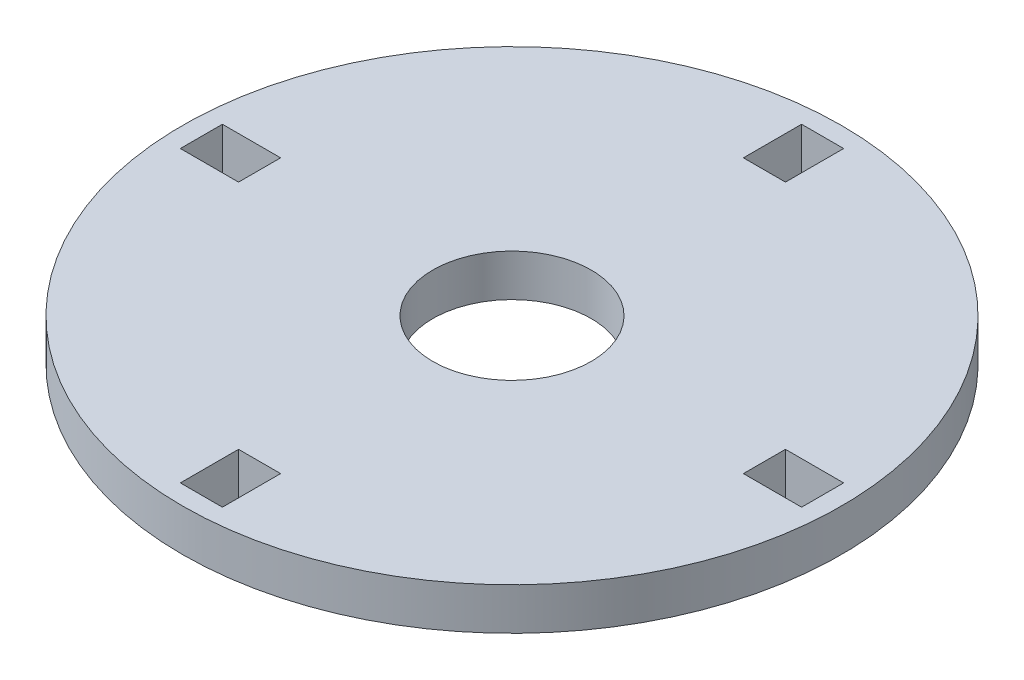
ISO-10303-21;
HEADER;
FILE_DESCRIPTION(('STEP AP214'),'2;1');
FILE_NAME('part.step','',(''),(''),'','','');
FILE_SCHEMA(('AUTOMOTIVE_DESIGN { 1 0 10303 214 1 1 1 1 }'));
ENDSEC;
DATA;
#1=APPLICATION_CONTEXT('core data for automotive mechanical design processes');
#2=APPLICATION_PROTOCOL_DEFINITION('international standard','automotive_design',2000,#1);
#3=PRODUCT_CONTEXT('',#1,'mechanical');
#4=PRODUCT('Part','Part','',(#3));
#5=PRODUCT_RELATED_PRODUCT_CATEGORY('part','',(#4));
#6=PRODUCT_DEFINITION_FORMATION('','',#4);
#7=PRODUCT_DEFINITION_CONTEXT('part definition',#1,'design');
#8=PRODUCT_DEFINITION('design','',#6,#7);
#9=PRODUCT_DEFINITION_SHAPE('','',#8);
#10=(LENGTH_UNIT() NAMED_UNIT(*) SI_UNIT(.MILLI.,.METRE.));
#11=(NAMED_UNIT(*) PLANE_ANGLE_UNIT() SI_UNIT($,.RADIAN.));
#12=(NAMED_UNIT(*) SI_UNIT($,.STERADIAN.) SOLID_ANGLE_UNIT());
#13=UNCERTAINTY_MEASURE_WITH_UNIT(LENGTH_MEASURE(1.E-05),#10,'distance_accuracy_value','');
#14=(GEOMETRIC_REPRESENTATION_CONTEXT(3) GLOBAL_UNCERTAINTY_ASSIGNED_CONTEXT((#13)) GLOBAL_UNIT_ASSIGNED_CONTEXT((#10,
#11,#12)) REPRESENTATION_CONTEXT('',''));
#15=CARTESIAN_POINT('',(0.,0.,0.));
#16=DIRECTION('',(0.,0.,1.));
#17=DIRECTION('',(1.,0.,0.));
#18=AXIS2_PLACEMENT_3D('',#15,#16,#17);
#19=CARTESIAN_POINT('',(0.,3.,0.));
#20=DIRECTION('',(0.,-1.,0.));
#21=DIRECTION('',(0.,0.,-1.));
#22=AXIS2_PLACEMENT_3D('',#19,#20,#21);
#23=CYLINDRICAL_SURFACE('',#22,23.5);
#24=CARTESIAN_POINT('',(0.,3.,0.));
#25=DIRECTION('',(0.,1.,0.));
#26=DIRECTION('',(0.,0.,1.));
#27=AXIS2_PLACEMENT_3D('',#24,#25,#26);
#28=CIRCLE('',#27,23.5);
#29=CARTESIAN_POINT('',(0.,3.,23.5));
#30=VERTEX_POINT('',#29);
#31=EDGE_CURVE('E13',#30,#30,#28,.T.);
#32=ORIENTED_EDGE('',*,*,#31,.F.);
#33=EDGE_LOOP('',(#32));
#34=FACE_BOUND('',#33,.T.);
#35=CARTESIAN_POINT('',(0.,0.,0.));
#36=DIRECTION('',(0.,1.,0.));
#37=DIRECTION('',(0.,0.,1.));
#38=AXIS2_PLACEMENT_3D('',#35,#36,#37);
#39=CIRCLE('',#38,23.5);
#40=CARTESIAN_POINT('',(0.,0.,23.5));
#41=VERTEX_POINT('',#40);
#42=EDGE_CURVE('E47',#41,#41,#39,.T.);
#43=ORIENTED_EDGE('',*,*,#42,.T.);
#44=EDGE_LOOP('',(#43));
#45=FACE_BOUND('',#44,.T.);
#46=ADVANCED_FACE('F44',(#34,#45),#23,.T.);
#47=CARTESIAN_POINT('',(0.,3.,0.));
#48=DIRECTION('',(0.,1.,0.));
#49=DIRECTION('',(0.,0.,1.));
#50=AXIS2_PLACEMENT_3D('',#47,#48,#49);
#51=PLANE('',#50);
#52=DIRECTION('',(0.,0.,1.));
#53=VECTOR('',#52,1.);
#54=CARTESIAN_POINT('',(1.5,3.,22.15));
#55=LINE('',#54,#53);
#56=CARTESIAN_POINT('',(1.5,3.,18.));
#57=VERTEX_POINT('',#56);
#58=CARTESIAN_POINT('',(1.5,3.,22.15));
#59=VERTEX_POINT('',#58);
#60=EDGE_CURVE('E160',#57,#59,#55,.T.);
#61=ORIENTED_EDGE('',*,*,#60,.T.);
#62=DIRECTION('',(-1.,0.,0.));
#63=VECTOR('',#62,1.);
#64=CARTESIAN_POINT('',(-1.5,3.,22.15));
#65=LINE('',#64,#63);
#66=CARTESIAN_POINT('',(-1.5,3.,22.15));
#67=VERTEX_POINT('',#66);
#68=EDGE_CURVE('E171',#59,#67,#65,.T.);
#69=ORIENTED_EDGE('',*,*,#68,.T.);
#70=DIRECTION('',(0.,0.,-1.));
#71=VECTOR('',#70,1.);
#72=CARTESIAN_POINT('',(-1.5,3.,22.15));
#73=LINE('',#72,#71);
#74=CARTESIAN_POINT('',(-1.5,3.,18.));
#75=VERTEX_POINT('',#74);
#76=EDGE_CURVE('E58',#67,#75,#73,.T.);
#77=ORIENTED_EDGE('',*,*,#76,.T.);
#78=DIRECTION('',(1.,0.,0.));
#79=VECTOR('',#78,1.);
#80=CARTESIAN_POINT('',(-1.5,3.,18.));
#81=LINE('',#80,#79);
#82=EDGE_CURVE('E168',#75,#57,#81,.T.);
#83=ORIENTED_EDGE('',*,*,#82,.T.);
#84=EDGE_LOOP('',(#61,#69,#77,#83));
#85=FACE_BOUND('',#84,.T.);
#86=DIRECTION('',(0.,0.,-1.));
#87=VECTOR('',#86,1.);
#88=CARTESIAN_POINT('',(18.,3.,1.49999999999994));
#89=LINE('',#88,#87);
#90=CARTESIAN_POINT('',(18.,3.,1.49999999999994));
#91=VERTEX_POINT('',#90);
#92=CARTESIAN_POINT('',(18.,3.,-1.50000000000006));
#93=VERTEX_POINT('',#92);
#94=EDGE_CURVE('E198',#91,#93,#89,.T.);
#95=ORIENTED_EDGE('',*,*,#94,.T.);
#96=DIRECTION('',(1.,0.,0.));
#97=VECTOR('',#96,1.);
#98=CARTESIAN_POINT('',(22.15,3.,-1.50000000000007));
#99=LINE('',#98,#97);
#100=CARTESIAN_POINT('',(22.15,3.,-1.50000000000007));
#101=VERTEX_POINT('',#100);
#102=EDGE_CURVE('E201',#93,#101,#99,.T.);
#103=ORIENTED_EDGE('',*,*,#102,.T.);
#104=DIRECTION('',(0.,0.,1.));
#105=VECTOR('',#104,1.);
#106=CARTESIAN_POINT('',(22.15,3.,1.49999999999993));
#107=LINE('',#106,#105);
#108=CARTESIAN_POINT('',(22.15,3.,1.49999999999993));
#109=VERTEX_POINT('',#108);
#110=EDGE_CURVE('E66',#101,#109,#107,.T.);
#111=ORIENTED_EDGE('',*,*,#110,.T.);
#112=DIRECTION('',(-1.,0.,0.));
#113=VECTOR('',#112,1.);
#114=CARTESIAN_POINT('',(22.15,3.,1.49999999999993));
#115=LINE('',#114,#113);
#116=EDGE_CURVE('E206',#109,#91,#115,.T.);
#117=ORIENTED_EDGE('',*,*,#116,.T.);
#118=EDGE_LOOP('',(#95,#103,#111,#117));
#119=FACE_BOUND('',#118,.T.);
#120=DIRECTION('',(-1.,0.,0.));
#121=VECTOR('',#120,1.);
#122=CARTESIAN_POINT('',(1.49999999999987,3.,-18.));
#123=LINE('',#122,#121);
#124=CARTESIAN_POINT('',(1.49999999999987,3.,-18.));
#125=VERTEX_POINT('',#124);
#126=CARTESIAN_POINT('',(-1.50000000000013,3.,-18.));
#127=VERTEX_POINT('',#126);
#128=EDGE_CURVE('E228',#125,#127,#123,.T.);
#129=ORIENTED_EDGE('',*,*,#128,.T.);
#130=DIRECTION('',(0.,0.,-1.));
#131=VECTOR('',#130,1.);
#132=CARTESIAN_POINT('',(-1.50000000000015,3.,-22.15));
#133=LINE('',#132,#131);
#134=CARTESIAN_POINT('',(-1.50000000000015,3.,-22.15));
#135=VERTEX_POINT('',#134);
#136=EDGE_CURVE('E231',#127,#135,#133,.T.);
#137=ORIENTED_EDGE('',*,*,#136,.T.);
#138=DIRECTION('',(1.,0.,0.));
#139=VECTOR('',#138,1.);
#140=CARTESIAN_POINT('',(1.49999999999985,3.,-22.15));
#141=LINE('',#140,#139);
#142=CARTESIAN_POINT('',(1.49999999999985,3.,-22.15));
#143=VERTEX_POINT('',#142);
#144=EDGE_CURVE('E235',#135,#143,#141,.T.);
#145=ORIENTED_EDGE('',*,*,#144,.T.);
#146=DIRECTION('',(0.,0.,1.));
#147=VECTOR('',#146,1.);
#148=CARTESIAN_POINT('',(1.49999999999985,3.,-22.15));
#149=LINE('',#148,#147);
#150=EDGE_CURVE('E238',#143,#125,#149,.T.);
#151=ORIENTED_EDGE('',*,*,#150,.T.);
#152=EDGE_LOOP('',(#129,#137,#145,#151));
#153=FACE_BOUND('',#152,.T.);
#154=DIRECTION('',(0.,0.,1.));
#155=VECTOR('',#154,1.);
#156=CARTESIAN_POINT('',(-18.,3.,-1.49999999999981));
#157=LINE('',#156,#155);
#158=CARTESIAN_POINT('',(-18.,3.,-1.49999999999981));
#159=VERTEX_POINT('',#158);
#160=CARTESIAN_POINT('',(-18.,3.,1.50000000000019));
#161=VERTEX_POINT('',#160);
#162=EDGE_CURVE('E260',#159,#161,#157,.T.);
#163=ORIENTED_EDGE('',*,*,#162,.T.);
#164=DIRECTION('',(-1.,0.,0.));
#165=VECTOR('',#164,1.);
#166=CARTESIAN_POINT('',(-22.15,3.,1.50000000000023));
#167=LINE('',#166,#165);
#168=CARTESIAN_POINT('',(-22.15,3.,1.50000000000023));
#169=VERTEX_POINT('',#168);
#170=EDGE_CURVE('E263',#161,#169,#167,.T.);
#171=ORIENTED_EDGE('',*,*,#170,.T.);
#172=DIRECTION('',(0.,0.,-1.));
#173=VECTOR('',#172,1.);
#174=CARTESIAN_POINT('',(-22.15,3.,-1.49999999999977));
#175=LINE('',#174,#173);
#176=CARTESIAN_POINT('',(-22.15,3.,-1.49999999999977));
#177=VERTEX_POINT('',#176);
#178=EDGE_CURVE('E267',#169,#177,#175,.T.);
#179=ORIENTED_EDGE('',*,*,#178,.T.);
#180=DIRECTION('',(1.,0.,0.));
#181=VECTOR('',#180,1.);
#182=CARTESIAN_POINT('',(-22.15,3.,-1.49999999999977));
#183=LINE('',#182,#181);
#184=EDGE_CURVE('E270',#177,#159,#183,.T.);
#185=ORIENTED_EDGE('',*,*,#184,.T.);
#186=EDGE_LOOP('',(#163,#171,#179,#185));
#187=FACE_BOUND('',#186,.T.);
#188=CARTESIAN_POINT('',(0.,3.,0.));
#189=DIRECTION('',(0.,1.,0.));
#190=DIRECTION('',(0.,0.,1.));
#191=AXIS2_PLACEMENT_3D('',#188,#189,#190);
#192=CIRCLE('',#191,5.65);
#193=CARTESIAN_POINT('',(0.,3.,5.65));
#194=VERTEX_POINT('',#193);
#195=EDGE_CURVE('E194',#194,#194,#192,.T.);
#196=ORIENTED_EDGE('',*,*,#195,.F.);
#197=EDGE_LOOP('',(#196));
#198=FACE_BOUND('',#197,.T.);
#199=ORIENTED_EDGE('',*,*,#31,.T.);
#200=EDGE_LOOP('',(#199));
#201=FACE_BOUND('',#200,.T.);
#202=ADVANCED_FACE('F175',(#85,#119,#153,#187,#198,#201),#51,.T.);
#203=CARTESIAN_POINT('',(0.,0.,0.));
#204=DIRECTION('',(0.,1.,0.));
#205=DIRECTION('',(0.,0.,1.));
#206=AXIS2_PLACEMENT_3D('',#203,#204,#205);
#207=PLANE('',#206);
#208=DIRECTION('',(-1.,0.,0.));
#209=VECTOR('',#208,1.);
#210=CARTESIAN_POINT('',(-1.5,0.,22.15));
#211=LINE('',#210,#209);
#212=CARTESIAN_POINT('',(1.5,0.,22.15));
#213=VERTEX_POINT('',#212);
#214=CARTESIAN_POINT('',(-1.5,0.,22.15));
#215=VERTEX_POINT('',#214);
#216=EDGE_CURVE('E187',#213,#215,#211,.T.);
#217=ORIENTED_EDGE('',*,*,#216,.F.);
#218=DIRECTION('',(0.,0.,1.));
#219=VECTOR('',#218,1.);
#220=CARTESIAN_POINT('',(1.5,0.,22.15));
#221=LINE('',#220,#219);
#222=CARTESIAN_POINT('',(1.5,0.,18.));
#223=VERTEX_POINT('',#222);
#224=EDGE_CURVE('E163',#223,#213,#221,.T.);
#225=ORIENTED_EDGE('',*,*,#224,.F.);
#226=DIRECTION('',(1.,0.,0.));
#227=VECTOR('',#226,1.);
#228=CARTESIAN_POINT('',(-1.5,0.,18.));
#229=LINE('',#228,#227);
#230=CARTESIAN_POINT('',(-1.5,0.,18.));
#231=VERTEX_POINT('',#230);
#232=EDGE_CURVE('E178',#231,#223,#229,.T.);
#233=ORIENTED_EDGE('',*,*,#232,.F.);
#234=DIRECTION('',(0.,0.,-1.));
#235=VECTOR('',#234,1.);
#236=CARTESIAN_POINT('',(-1.5,0.,22.15));
#237=LINE('',#236,#235);
#238=EDGE_CURVE('E181',#215,#231,#237,.T.);
#239=ORIENTED_EDGE('',*,*,#238,.F.);
#240=EDGE_LOOP('',(#217,#225,#233,#239));
#241=FACE_BOUND('',#240,.T.);
#242=DIRECTION('',(1.,0.,0.));
#243=VECTOR('',#242,1.);
#244=CARTESIAN_POINT('',(22.15,0.,-1.50000000000007));
#245=LINE('',#244,#243);
#246=CARTESIAN_POINT('',(18.,0.,-1.50000000000006));
#247=VERTEX_POINT('',#246);
#248=CARTESIAN_POINT('',(22.15,0.,-1.50000000000007));
#249=VERTEX_POINT('',#248);
#250=EDGE_CURVE('E212',#247,#249,#245,.T.);
#251=ORIENTED_EDGE('',*,*,#250,.F.);
#252=DIRECTION('',(0.,0.,-1.));
#253=VECTOR('',#252,1.);
#254=CARTESIAN_POINT('',(18.,0.,1.49999999999994));
#255=LINE('',#254,#253);
#256=CARTESIAN_POINT('',(18.,0.,1.49999999999994));
#257=VERTEX_POINT('',#256);
#258=EDGE_CURVE('E210',#257,#247,#255,.T.);
#259=ORIENTED_EDGE('',*,*,#258,.F.);
#260=DIRECTION('',(-1.,0.,0.));
#261=VECTOR('',#260,1.);
#262=CARTESIAN_POINT('',(22.15,0.,1.49999999999993));
#263=LINE('',#262,#261);
#264=CARTESIAN_POINT('',(22.15,0.,1.49999999999993));
#265=VERTEX_POINT('',#264);
#266=EDGE_CURVE('E202',#265,#257,#263,.T.);
#267=ORIENTED_EDGE('',*,*,#266,.F.);
#268=DIRECTION('',(0.,0.,1.));
#269=VECTOR('',#268,1.);
#270=CARTESIAN_POINT('',(22.15,0.,1.49999999999993));
#271=LINE('',#270,#269);
#272=EDGE_CURVE('E216',#249,#265,#271,.T.);
#273=ORIENTED_EDGE('',*,*,#272,.F.);
#274=EDGE_LOOP('',(#251,#259,#267,#273));
#275=FACE_BOUND('',#274,.T.);
#276=DIRECTION('',(0.,0.,-1.));
#277=VECTOR('',#276,1.);
#278=CARTESIAN_POINT('',(-1.50000000000015,0.,-22.15));
#279=LINE('',#278,#277);
#280=CARTESIAN_POINT('',(-1.50000000000013,0.,-18.));
#281=VERTEX_POINT('',#280);
#282=CARTESIAN_POINT('',(-1.50000000000015,0.,-22.15));
#283=VERTEX_POINT('',#282);
#284=EDGE_CURVE('E244',#281,#283,#279,.T.);
#285=ORIENTED_EDGE('',*,*,#284,.F.);
#286=DIRECTION('',(-1.,0.,0.));
#287=VECTOR('',#286,1.);
#288=CARTESIAN_POINT('',(1.49999999999987,0.,-18.));
#289=LINE('',#288,#287);
#290=CARTESIAN_POINT('',(1.49999999999987,0.,-18.));
#291=VERTEX_POINT('',#290);
#292=EDGE_CURVE('E242',#291,#281,#289,.T.);
#293=ORIENTED_EDGE('',*,*,#292,.F.);
#294=DIRECTION('',(0.,0.,1.));
#295=VECTOR('',#294,1.);
#296=CARTESIAN_POINT('',(1.49999999999985,0.,-22.15));
#297=LINE('',#296,#295);
#298=CARTESIAN_POINT('',(1.49999999999985,0.,-22.15));
#299=VERTEX_POINT('',#298);
#300=EDGE_CURVE('E232',#299,#291,#297,.T.);
#301=ORIENTED_EDGE('',*,*,#300,.F.);
#302=DIRECTION('',(1.,0.,0.));
#303=VECTOR('',#302,1.);
#304=CARTESIAN_POINT('',(1.49999999999985,0.,-22.15));
#305=LINE('',#304,#303);
#306=EDGE_CURVE('E248',#283,#299,#305,.T.);
#307=ORIENTED_EDGE('',*,*,#306,.F.);
#308=EDGE_LOOP('',(#285,#293,#301,#307));
#309=FACE_BOUND('',#308,.T.);
#310=DIRECTION('',(-1.,0.,0.));
#311=VECTOR('',#310,1.);
#312=CARTESIAN_POINT('',(-22.15,0.,1.50000000000023));
#313=LINE('',#312,#311);
#314=CARTESIAN_POINT('',(-18.,0.,1.50000000000019));
#315=VERTEX_POINT('',#314);
#316=CARTESIAN_POINT('',(-22.15,0.,1.50000000000023));
#317=VERTEX_POINT('',#316);
#318=EDGE_CURVE('E276',#315,#317,#313,.T.);
#319=ORIENTED_EDGE('',*,*,#318,.F.);
#320=DIRECTION('',(0.,0.,1.));
#321=VECTOR('',#320,1.);
#322=CARTESIAN_POINT('',(-18.,0.,-1.49999999999981));
#323=LINE('',#322,#321);
#324=CARTESIAN_POINT('',(-18.,0.,-1.49999999999981));
#325=VERTEX_POINT('',#324);
#326=EDGE_CURVE('E274',#325,#315,#323,.T.);
#327=ORIENTED_EDGE('',*,*,#326,.F.);
#328=DIRECTION('',(1.,0.,0.));
#329=VECTOR('',#328,1.);
#330=CARTESIAN_POINT('',(-22.15,0.,-1.49999999999977));
#331=LINE('',#330,#329);
#332=CARTESIAN_POINT('',(-22.15,0.,-1.49999999999977));
#333=VERTEX_POINT('',#332);
#334=EDGE_CURVE('E264',#333,#325,#331,.T.);
#335=ORIENTED_EDGE('',*,*,#334,.F.);
#336=DIRECTION('',(0.,0.,-1.));
#337=VECTOR('',#336,1.);
#338=CARTESIAN_POINT('',(-22.15,0.,-1.49999999999977));
#339=LINE('',#338,#337);
#340=EDGE_CURVE('E279',#317,#333,#339,.T.);
#341=ORIENTED_EDGE('',*,*,#340,.F.);
#342=EDGE_LOOP('',(#319,#327,#335,#341));
#343=FACE_BOUND('',#342,.T.);
#344=CARTESIAN_POINT('',(0.,0.,0.));
#345=DIRECTION('',(0.,1.,0.));
#346=DIRECTION('',(0.,0.,1.));
#347=AXIS2_PLACEMENT_3D('',#344,#345,#346);
#348=CIRCLE('',#347,5.65);
#349=CARTESIAN_POINT('',(0.,0.,5.65));
#350=VERTEX_POINT('',#349);
#351=EDGE_CURVE('E291',#350,#350,#348,.T.);
#352=ORIENTED_EDGE('',*,*,#351,.T.);
#353=EDGE_LOOP('',(#352));
#354=FACE_BOUND('',#353,.T.);
#355=ORIENTED_EDGE('',*,*,#42,.F.);
#356=EDGE_LOOP('',(#355));
#357=FACE_BOUND('',#356,.T.);
#358=ADVANCED_FACE('F301',(#241,#275,#309,#343,#354,#357),#207,.F.);
#359=CARTESIAN_POINT('',(0.,0.,0.));
#360=DIRECTION('',(0.,1.,0.));
#361=DIRECTION('',(0.,0.,1.));
#362=AXIS2_PLACEMENT_3D('',#359,#360,#361);
#363=CYLINDRICAL_SURFACE('',#362,5.65);
#364=ORIENTED_EDGE('',*,*,#351,.F.);
#365=EDGE_LOOP('',(#364));
#366=FACE_BOUND('',#365,.T.);
#367=ORIENTED_EDGE('',*,*,#195,.T.);
#368=EDGE_LOOP('',(#367));
#369=FACE_BOUND('',#368,.T.);
#370=ADVANCED_FACE('F297',(#366,#369),#363,.F.);
#371=CARTESIAN_POINT('',(-18.,3.,-1.49999999999981));
#372=DIRECTION('',(1.,0.,0.));
#373=DIRECTION('',(0.,0.,-1.));
#374=AXIS2_PLACEMENT_3D('',#371,#372,#373);
#375=PLANE('',#374);
#376=ORIENTED_EDGE('',*,*,#326,.T.);
#377=DIRECTION('',(0.,-1.,0.));
#378=VECTOR('',#377,1.);
#379=CARTESIAN_POINT('',(-18.,3.,1.50000000000019));
#380=LINE('',#379,#378);
#381=EDGE_CURVE('E273',#161,#315,#380,.T.);
#382=ORIENTED_EDGE('',*,*,#381,.F.);
#383=ORIENTED_EDGE('',*,*,#162,.F.);
#384=DIRECTION('',(0.,-1.,0.));
#385=VECTOR('',#384,1.);
#386=CARTESIAN_POINT('',(-18.,3.,-1.49999999999981));
#387=LINE('',#386,#385);
#388=EDGE_CURVE('E245',#159,#325,#387,.T.);
#389=ORIENTED_EDGE('',*,*,#388,.T.);
#390=EDGE_LOOP('',(#376,#382,#383,#389));
#391=FACE_BOUND('',#390,.T.);
#392=ADVANCED_FACE('F315',(#391),#375,.F.);
#393=CARTESIAN_POINT('',(-22.15,3.,-1.49999999999977));
#394=DIRECTION('',(0.,0.,-1.));
#395=DIRECTION('',(-1.,0.,0.));
#396=AXIS2_PLACEMENT_3D('',#393,#394,#395);
#397=PLANE('',#396);
#398=ORIENTED_EDGE('',*,*,#334,.T.);
#399=ORIENTED_EDGE('',*,*,#388,.F.);
#400=ORIENTED_EDGE('',*,*,#184,.F.);
#401=DIRECTION('',(0.,-1.,0.));
#402=VECTOR('',#401,1.);
#403=CARTESIAN_POINT('',(-22.15,3.,-1.49999999999977));
#404=LINE('',#403,#402);
#405=EDGE_CURVE('E285',#177,#333,#404,.T.);
#406=ORIENTED_EDGE('',*,*,#405,.T.);
#407=EDGE_LOOP('',(#398,#399,#400,#406));
#408=FACE_BOUND('',#407,.T.);
#409=ADVANCED_FACE('F322',(#408),#397,.F.);
#410=CARTESIAN_POINT('',(-22.15,3.,-1.49999999999977));
#411=DIRECTION('',(-1.,0.,0.));
#412=DIRECTION('',(0.,0.,1.));
#413=AXIS2_PLACEMENT_3D('',#410,#411,#412);
#414=PLANE('',#413);
#415=ORIENTED_EDGE('',*,*,#340,.T.);
#416=ORIENTED_EDGE('',*,*,#405,.F.);
#417=ORIENTED_EDGE('',*,*,#178,.F.);
#418=DIRECTION('',(0.,-1.,0.));
#419=VECTOR('',#418,1.);
#420=CARTESIAN_POINT('',(-22.15,3.,1.50000000000023));
#421=LINE('',#420,#419);
#422=EDGE_CURVE('E287',#169,#317,#421,.T.);
#423=ORIENTED_EDGE('',*,*,#422,.T.);
#424=EDGE_LOOP('',(#415,#416,#417,#423));
#425=FACE_BOUND('',#424,.T.);
#426=ADVANCED_FACE('F328',(#425),#414,.F.);
#427=CARTESIAN_POINT('',(-22.15,3.,1.50000000000023));
#428=DIRECTION('',(0.,0.,1.));
#429=DIRECTION('',(1.,0.,0.));
#430=AXIS2_PLACEMENT_3D('',#427,#428,#429);
#431=PLANE('',#430);
#432=ORIENTED_EDGE('',*,*,#318,.T.);
#433=ORIENTED_EDGE('',*,*,#422,.F.);
#434=ORIENTED_EDGE('',*,*,#170,.F.);
#435=ORIENTED_EDGE('',*,*,#381,.T.);
#436=EDGE_LOOP('',(#432,#433,#434,#435));
#437=FACE_BOUND('',#436,.T.);
#438=ADVANCED_FACE('F324',(#437),#431,.F.);
#439=CARTESIAN_POINT('',(1.49999999999987,3.,-18.));
#440=DIRECTION('',(0.,0.,1.));
#441=DIRECTION('',(1.,0.,0.));
#442=AXIS2_PLACEMENT_3D('',#439,#440,#441);
#443=PLANE('',#442);
#444=ORIENTED_EDGE('',*,*,#292,.T.);
#445=DIRECTION('',(0.,-1.,0.));
#446=VECTOR('',#445,1.);
#447=CARTESIAN_POINT('',(-1.50000000000013,3.,-18.));
#448=LINE('',#447,#446);
#449=EDGE_CURVE('E241',#127,#281,#448,.T.);
#450=ORIENTED_EDGE('',*,*,#449,.F.);
#451=ORIENTED_EDGE('',*,*,#128,.F.);
#452=DIRECTION('',(0.,-1.,0.));
#453=VECTOR('',#452,1.);
#454=CARTESIAN_POINT('',(1.49999999999987,3.,-18.));
#455=LINE('',#454,#453);
#456=EDGE_CURVE('E213',#125,#291,#455,.T.);
#457=ORIENTED_EDGE('',*,*,#456,.T.);
#458=EDGE_LOOP('',(#444,#450,#451,#457));
#459=FACE_BOUND('',#458,.T.);
#460=ADVANCED_FACE('F327',(#459),#443,.F.);
#461=CARTESIAN_POINT('',(1.49999999999985,3.,-22.15));
#462=DIRECTION('',(1.,0.,0.));
#463=DIRECTION('',(0.,0.,-1.));
#464=AXIS2_PLACEMENT_3D('',#461,#462,#463);
#465=PLANE('',#464);
#466=ORIENTED_EDGE('',*,*,#300,.T.);
#467=ORIENTED_EDGE('',*,*,#456,.F.);
#468=ORIENTED_EDGE('',*,*,#150,.F.);
#469=DIRECTION('',(0.,-1.,0.));
#470=VECTOR('',#469,1.);
#471=CARTESIAN_POINT('',(1.49999999999985,3.,-22.15));
#472=LINE('',#471,#470);
#473=EDGE_CURVE('E254',#143,#299,#472,.T.);
#474=ORIENTED_EDGE('',*,*,#473,.T.);
#475=EDGE_LOOP('',(#466,#467,#468,#474));
#476=FACE_BOUND('',#475,.T.);
#477=ADVANCED_FACE('F338',(#476),#465,.F.);
#478=CARTESIAN_POINT('',(1.49999999999985,3.,-22.15));
#479=DIRECTION('',(0.,0.,-1.));
#480=DIRECTION('',(-1.,0.,0.));
#481=AXIS2_PLACEMENT_3D('',#478,#479,#480);
#482=PLANE('',#481);
#483=ORIENTED_EDGE('',*,*,#306,.T.);
#484=ORIENTED_EDGE('',*,*,#473,.F.);
#485=ORIENTED_EDGE('',*,*,#144,.F.);
#486=DIRECTION('',(0.,-1.,0.));
#487=VECTOR('',#486,1.);
#488=CARTESIAN_POINT('',(-1.50000000000015,3.,-22.15));
#489=LINE('',#488,#487);
#490=EDGE_CURVE('E256',#135,#283,#489,.T.);
#491=ORIENTED_EDGE('',*,*,#490,.T.);
#492=EDGE_LOOP('',(#483,#484,#485,#491));
#493=FACE_BOUND('',#492,.T.);
#494=ADVANCED_FACE('F344',(#493),#482,.F.);
#495=CARTESIAN_POINT('',(-1.50000000000015,3.,-22.15));
#496=DIRECTION('',(-1.,0.,0.));
#497=DIRECTION('',(0.,0.,1.));
#498=AXIS2_PLACEMENT_3D('',#495,#496,#497);
#499=PLANE('',#498);
#500=ORIENTED_EDGE('',*,*,#284,.T.);
#501=ORIENTED_EDGE('',*,*,#490,.F.);
#502=ORIENTED_EDGE('',*,*,#136,.F.);
#503=ORIENTED_EDGE('',*,*,#449,.T.);
#504=EDGE_LOOP('',(#500,#501,#502,#503));
#505=FACE_BOUND('',#504,.T.);
#506=ADVANCED_FACE('F340',(#505),#499,.F.);
#507=CARTESIAN_POINT('',(18.,3.,1.49999999999994));
#508=DIRECTION('',(-1.,0.,0.));
#509=DIRECTION('',(0.,0.,1.));
#510=AXIS2_PLACEMENT_3D('',#507,#508,#509);
#511=PLANE('',#510);
#512=ORIENTED_EDGE('',*,*,#258,.T.);
#513=DIRECTION('',(0.,-1.,0.));
#514=VECTOR('',#513,1.);
#515=CARTESIAN_POINT('',(18.,3.,-1.50000000000006));
#516=LINE('',#515,#514);
#517=EDGE_CURVE('E209',#93,#247,#516,.T.);
#518=ORIENTED_EDGE('',*,*,#517,.F.);
#519=ORIENTED_EDGE('',*,*,#94,.F.);
#520=DIRECTION('',(0.,-1.,0.));
#521=VECTOR('',#520,1.);
#522=CARTESIAN_POINT('',(18.,3.,1.49999999999994));
#523=LINE('',#522,#521);
#524=EDGE_CURVE('E188',#91,#257,#523,.T.);
#525=ORIENTED_EDGE('',*,*,#524,.T.);
#526=EDGE_LOOP('',(#512,#518,#519,#525));
#527=FACE_BOUND('',#526,.T.);
#528=ADVANCED_FACE('F343',(#527),#511,.F.);
#529=CARTESIAN_POINT('',(22.15,3.,1.49999999999993));
#530=DIRECTION('',(0.,0.,1.));
#531=DIRECTION('',(1.,0.,0.));
#532=AXIS2_PLACEMENT_3D('',#529,#530,#531);
#533=PLANE('',#532);
#534=ORIENTED_EDGE('',*,*,#266,.T.);
#535=ORIENTED_EDGE('',*,*,#524,.F.);
#536=ORIENTED_EDGE('',*,*,#116,.F.);
#537=DIRECTION('',(0.,-1.,0.));
#538=VECTOR('',#537,1.);
#539=CARTESIAN_POINT('',(22.15,3.,1.49999999999993));
#540=LINE('',#539,#538);
#541=EDGE_CURVE('E222',#109,#265,#540,.T.);
#542=ORIENTED_EDGE('',*,*,#541,.T.);
#543=EDGE_LOOP('',(#534,#535,#536,#542));
#544=FACE_BOUND('',#543,.T.);
#545=ADVANCED_FACE('F354',(#544),#533,.F.);
#546=CARTESIAN_POINT('',(22.15,3.,1.49999999999993));
#547=DIRECTION('',(1.,0.,0.));
#548=DIRECTION('',(0.,0.,-1.));
#549=AXIS2_PLACEMENT_3D('',#546,#547,#548);
#550=PLANE('',#549);
#551=ORIENTED_EDGE('',*,*,#272,.T.);
#552=ORIENTED_EDGE('',*,*,#541,.F.);
#553=ORIENTED_EDGE('',*,*,#110,.F.);
#554=DIRECTION('',(0.,-1.,0.));
#555=VECTOR('',#554,1.);
#556=CARTESIAN_POINT('',(22.15,3.,-1.50000000000007));
#557=LINE('',#556,#555);
#558=EDGE_CURVE('E224',#101,#249,#557,.T.);
#559=ORIENTED_EDGE('',*,*,#558,.T.);
#560=EDGE_LOOP('',(#551,#552,#553,#559));
#561=FACE_BOUND('',#560,.T.);
#562=ADVANCED_FACE('F359',(#561),#550,.F.);
#563=CARTESIAN_POINT('',(22.15,3.,-1.50000000000007));
#564=DIRECTION('',(0.,0.,-1.));
#565=DIRECTION('',(-1.,0.,0.));
#566=AXIS2_PLACEMENT_3D('',#563,#564,#565);
#567=PLANE('',#566);
#568=ORIENTED_EDGE('',*,*,#250,.T.);
#569=ORIENTED_EDGE('',*,*,#558,.F.);
#570=ORIENTED_EDGE('',*,*,#102,.F.);
#571=ORIENTED_EDGE('',*,*,#517,.T.);
#572=EDGE_LOOP('',(#568,#569,#570,#571));
#573=FACE_BOUND('',#572,.T.);
#574=ADVANCED_FACE('F356',(#573),#567,.F.);
#575=CARTESIAN_POINT('',(1.5,3.,22.15));
#576=DIRECTION('',(1.,0.,0.));
#577=DIRECTION('',(0.,0.,-1.));
#578=AXIS2_PLACEMENT_3D('',#575,#576,#577);
#579=PLANE('',#578);
#580=ORIENTED_EDGE('',*,*,#224,.T.);
#581=DIRECTION('',(0.,-1.,0.));
#582=VECTOR('',#581,1.);
#583=CARTESIAN_POINT('',(1.5,3.,22.15));
#584=LINE('',#583,#582);
#585=EDGE_CURVE('E156',#59,#213,#584,.T.);
#586=ORIENTED_EDGE('',*,*,#585,.F.);
#587=ORIENTED_EDGE('',*,*,#60,.F.);
#588=DIRECTION('',(0.,-1.,0.));
#589=VECTOR('',#588,1.);
#590=CARTESIAN_POINT('',(1.5,3.,18.));
#591=LINE('',#590,#589);
#592=EDGE_CURVE('E192',#57,#223,#591,.T.);
#593=ORIENTED_EDGE('',*,*,#592,.T.);
#594=EDGE_LOOP('',(#580,#586,#587,#593));
#595=FACE_BOUND('',#594,.T.);
#596=ADVANCED_FACE('F158',(#595),#579,.F.);
#597=CARTESIAN_POINT('',(-1.5,3.,18.));
#598=DIRECTION('',(0.,0.,-1.));
#599=DIRECTION('',(-1.,0.,0.));
#600=AXIS2_PLACEMENT_3D('',#597,#598,#599);
#601=PLANE('',#600);
#602=ORIENTED_EDGE('',*,*,#232,.T.);
#603=ORIENTED_EDGE('',*,*,#592,.F.);
#604=ORIENTED_EDGE('',*,*,#82,.F.);
#605=DIRECTION('',(0.,-1.,0.));
#606=VECTOR('',#605,1.);
#607=CARTESIAN_POINT('',(-1.5,3.,18.));
#608=LINE('',#607,#606);
#609=EDGE_CURVE('E195',#75,#231,#608,.T.);
#610=ORIENTED_EDGE('',*,*,#609,.T.);
#611=EDGE_LOOP('',(#602,#603,#604,#610));
#612=FACE_BOUND('',#611,.T.);
#613=ADVANCED_FACE('F368',(#612),#601,.F.);
#614=CARTESIAN_POINT('',(-1.5,3.,22.15));
#615=DIRECTION('',(-1.,0.,0.));
#616=DIRECTION('',(0.,0.,1.));
#617=AXIS2_PLACEMENT_3D('',#614,#615,#616);
#618=PLANE('',#617);
#619=ORIENTED_EDGE('',*,*,#238,.T.);
#620=ORIENTED_EDGE('',*,*,#609,.F.);
#621=ORIENTED_EDGE('',*,*,#76,.F.);
#622=DIRECTION('',(0.,-1.,0.));
#623=VECTOR('',#622,1.);
#624=CARTESIAN_POINT('',(-1.5,3.,22.15));
#625=LINE('',#624,#623);
#626=EDGE_CURVE('E167',#67,#215,#625,.T.);
#627=ORIENTED_EDGE('',*,*,#626,.T.);
#628=EDGE_LOOP('',(#619,#620,#621,#627));
#629=FACE_BOUND('',#628,.T.);
#630=ADVANCED_FACE('F371',(#629),#618,.F.);
#631=CARTESIAN_POINT('',(-1.5,3.,22.15));
#632=DIRECTION('',(0.,0.,1.));
#633=DIRECTION('',(1.,0.,0.));
#634=AXIS2_PLACEMENT_3D('',#631,#632,#633);
#635=PLANE('',#634);
#636=ORIENTED_EDGE('',*,*,#216,.T.);
#637=ORIENTED_EDGE('',*,*,#626,.F.);
#638=ORIENTED_EDGE('',*,*,#68,.F.);
#639=ORIENTED_EDGE('',*,*,#585,.T.);
#640=EDGE_LOOP('',(#636,#637,#638,#639));
#641=FACE_BOUND('',#640,.T.);
#642=ADVANCED_FACE('F172',(#641),#635,.F.);
#643=CLOSED_SHELL('',(#46,#202,#358,#370,#392,#409,#426,#438,#460,#477,#494,#506,#528,#545,#562,
#574,#596,#613,#630,#642));
#644=MANIFOLD_SOLID_BREP('B2',#643);
#645=ADVANCED_BREP_SHAPE_REPRESENTATION('',(#18,#644),#14);
#646=SHAPE_DEFINITION_REPRESENTATION(#9,#645);
ENDSEC;
END-ISO-10303-21;
